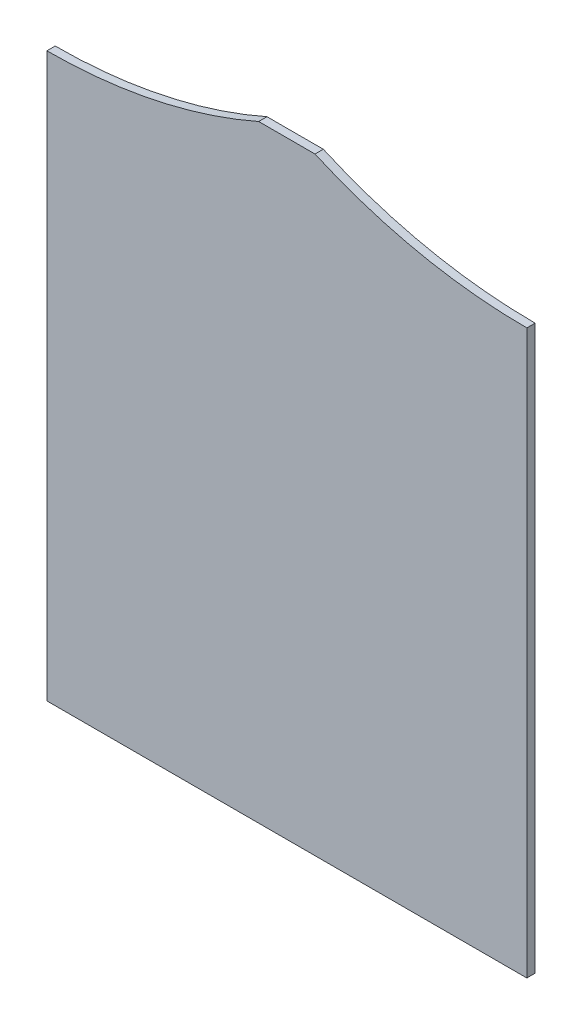
ISO-10303-21;
HEADER;
FILE_DESCRIPTION(('STEP AP214'),'2;1');
FILE_NAME('part.step','',(''),(''),'','','');
FILE_SCHEMA(('AUTOMOTIVE_DESIGN { 1 0 10303 214 1 1 1 1 }'));
ENDSEC;
DATA;
#1=APPLICATION_CONTEXT('core data for automotive mechanical design processes');
#2=APPLICATION_PROTOCOL_DEFINITION('international standard','automotive_design',2000,#1);
#3=PRODUCT_CONTEXT('',#1,'mechanical');
#4=PRODUCT('Part','Part','',(#3));
#5=PRODUCT_RELATED_PRODUCT_CATEGORY('part','',(#4));
#6=PRODUCT_DEFINITION_FORMATION('','',#4);
#7=PRODUCT_DEFINITION_CONTEXT('part definition',#1,'design');
#8=PRODUCT_DEFINITION('design','',#6,#7);
#9=PRODUCT_DEFINITION_SHAPE('','',#8);
#10=(LENGTH_UNIT() NAMED_UNIT(*) SI_UNIT(.MILLI.,.METRE.));
#11=(NAMED_UNIT(*) PLANE_ANGLE_UNIT() SI_UNIT($,.RADIAN.));
#12=(NAMED_UNIT(*) SI_UNIT($,.STERADIAN.) SOLID_ANGLE_UNIT());
#13=UNCERTAINTY_MEASURE_WITH_UNIT(LENGTH_MEASURE(1.E-05),#10,'distance_accuracy_value','');
#14=(GEOMETRIC_REPRESENTATION_CONTEXT(3) GLOBAL_UNCERTAINTY_ASSIGNED_CONTEXT((#13)) GLOBAL_UNIT_ASSIGNED_CONTEXT((#10,
#11,#12)) REPRESENTATION_CONTEXT('',''));
#15=CARTESIAN_POINT('',(0.,0.,0.));
#16=DIRECTION('',(0.,0.,1.));
#17=DIRECTION('',(1.,0.,0.));
#18=AXIS2_PLACEMENT_3D('',#15,#16,#17);
#19=CARTESIAN_POINT('',(-135.147392290249,273.641202928556,2.95));
#20=DIRECTION('',(0.,0.,-1.));
#21=DIRECTION('',(-1.,0.,0.));
#22=AXIS2_PLACEMENT_3D('',#19,#20,#21);
#23=CYLINDRICAL_SURFACE('',#22,186.339615626969);
#24=CARTESIAN_POINT('',(-135.147392290249,273.641202928556,0.));
#25=DIRECTION('',(0.,0.,-1.));
#26=DIRECTION('',(1.,0.,0.));
#27=AXIS2_PLACEMENT_3D('',#24,#25,#26);
#28=CIRCLE('',#27,186.339615626969);
#29=CARTESIAN_POINT('',(-59.8973922902495,103.171587301587,0.));
#30=VERTEX_POINT('',#29);
#31=CARTESIAN_POINT('',(-135.147392290249,87.3015873015873,0.));
#32=VERTEX_POINT('',#31);
#33=EDGE_CURVE('E116',#30,#32,#28,.T.);
#34=ORIENTED_EDGE('',*,*,#33,.T.);
#35=DIRECTION('',(0.,0.,-1.));
#36=VECTOR('',#35,1.);
#37=CARTESIAN_POINT('',(-135.147392290249,87.3015873015873,2.95));
#38=LINE('',#37,#36);
#39=CARTESIAN_POINT('',(-135.147392290249,87.3015873015873,2.95));
#40=VERTEX_POINT('',#39);
#41=EDGE_CURVE('E11',#40,#32,#38,.T.);
#42=ORIENTED_EDGE('',*,*,#41,.F.);
#43=CARTESIAN_POINT('',(-135.147392290249,273.641202928556,2.95));
#44=DIRECTION('',(0.,0.,-1.));
#45=DIRECTION('',(1.,0.,0.));
#46=AXIS2_PLACEMENT_3D('',#43,#44,#45);
#47=CIRCLE('',#46,186.339615626969);
#48=CARTESIAN_POINT('',(-59.8973922902495,103.171587301587,2.95));
#49=VERTEX_POINT('',#48);
#50=EDGE_CURVE('E126',#49,#40,#47,.T.);
#51=ORIENTED_EDGE('',*,*,#50,.F.);
#52=DIRECTION('',(0.,0.,-1.));
#53=VECTOR('',#52,1.);
#54=CARTESIAN_POINT('',(-59.8973922902495,103.171587301587,2.95));
#55=LINE('',#54,#53);
#56=EDGE_CURVE('E112',#49,#30,#55,.T.);
#57=ORIENTED_EDGE('',*,*,#56,.T.);
#58=EDGE_LOOP('',(#34,#42,#51,#57));
#59=FACE_BOUND('',#58,.T.);
#60=ADVANCED_FACE('F32',(#59),#23,.F.);
#61=CARTESIAN_POINT('',(-135.147392290249,87.3015873015873,2.95));
#62=DIRECTION('',(1.,0.,0.));
#63=DIRECTION('',(0.,0.,-1.));
#64=AXIS2_PLACEMENT_3D('',#61,#62,#63);
#65=PLANE('',#64);
#66=DIRECTION('',(0.,-1.,0.));
#67=VECTOR('',#66,1.);
#68=CARTESIAN_POINT('',(-135.147392290249,87.3015873015873,0.));
#69=LINE('',#68,#67);
#70=CARTESIAN_POINT('',(-135.147392290249,-112.698412698413,0.));
#71=VERTEX_POINT('',#70);
#72=EDGE_CURVE('E119',#32,#71,#69,.T.);
#73=ORIENTED_EDGE('',*,*,#72,.T.);
#74=DIRECTION('',(0.,0.,-1.));
#75=VECTOR('',#74,1.);
#76=CARTESIAN_POINT('',(-135.147392290249,-112.698412698413,2.95));
#77=LINE('',#76,#75);
#78=CARTESIAN_POINT('',(-135.147392290249,-112.698412698413,2.95));
#79=VERTEX_POINT('',#78);
#80=EDGE_CURVE('E40',#79,#71,#77,.T.);
#81=ORIENTED_EDGE('',*,*,#80,.F.);
#82=DIRECTION('',(0.,-1.,0.));
#83=VECTOR('',#82,1.);
#84=CARTESIAN_POINT('',(-135.147392290249,87.3015873015873,2.95));
#85=LINE('',#84,#83);
#86=EDGE_CURVE('E85',#40,#79,#85,.T.);
#87=ORIENTED_EDGE('',*,*,#86,.F.);
#88=ORIENTED_EDGE('',*,*,#41,.T.);
#89=EDGE_LOOP('',(#73,#81,#87,#88));
#90=FACE_BOUND('',#89,.T.);
#91=ADVANCED_FACE('F150',(#90),#65,.F.);
#92=CARTESIAN_POINT('',(-135.147392290249,-112.698412698413,2.95));
#93=DIRECTION('',(0.,1.,0.));
#94=DIRECTION('',(0.,0.,1.));
#95=AXIS2_PLACEMENT_3D('',#92,#93,#94);
#96=PLANE('',#95);
#97=DIRECTION('',(1.,0.,0.));
#98=VECTOR('',#97,1.);
#99=CARTESIAN_POINT('',(-135.147392290249,-112.698412698413,0.));
#100=LINE('',#99,#98);
#101=CARTESIAN_POINT('',(35.3526077097505,-112.698412698413,0.));
#102=VERTEX_POINT('',#101);
#103=EDGE_CURVE('E121',#71,#102,#100,.T.);
#104=ORIENTED_EDGE('',*,*,#103,.T.);
#105=DIRECTION('',(0.,0.,-1.));
#106=VECTOR('',#105,1.);
#107=CARTESIAN_POINT('',(35.3526077097505,-112.698412698413,2.95));
#108=LINE('',#107,#106);
#109=CARTESIAN_POINT('',(35.3526077097505,-112.698412698413,2.95));
#110=VERTEX_POINT('',#109);
#111=EDGE_CURVE('E107',#110,#102,#108,.T.);
#112=ORIENTED_EDGE('',*,*,#111,.F.);
#113=DIRECTION('',(1.,0.,0.));
#114=VECTOR('',#113,1.);
#115=CARTESIAN_POINT('',(-135.147392290249,-112.698412698413,2.95));
#116=LINE('',#115,#114);
#117=EDGE_CURVE('E98',#79,#110,#116,.T.);
#118=ORIENTED_EDGE('',*,*,#117,.F.);
#119=ORIENTED_EDGE('',*,*,#80,.T.);
#120=EDGE_LOOP('',(#104,#112,#118,#119));
#121=FACE_BOUND('',#120,.T.);
#122=ADVANCED_FACE('F132',(#121),#96,.F.);
#123=CARTESIAN_POINT('',(35.3526077097505,87.3015873015873,2.95));
#124=DIRECTION('',(-1.,0.,0.));
#125=DIRECTION('',(0.,-1.,0.));
#126=AXIS2_PLACEMENT_3D('',#123,#124,#125);
#127=PLANE('',#126);
#128=DIRECTION('',(0.,1.,0.));
#129=VECTOR('',#128,1.);
#130=CARTESIAN_POINT('',(35.3526077097505,87.3015873015873,0.));
#131=LINE('',#130,#129);
#132=CARTESIAN_POINT('',(35.3526077097505,87.3015873015873,0.));
#133=VERTEX_POINT('',#132);
#134=EDGE_CURVE('E106',#102,#133,#131,.T.);
#135=ORIENTED_EDGE('',*,*,#134,.T.);
#136=DIRECTION('',(0.,0.,-1.));
#137=VECTOR('',#136,1.);
#138=CARTESIAN_POINT('',(35.3526077097505,87.3015873015873,2.95));
#139=LINE('',#138,#137);
#140=CARTESIAN_POINT('',(35.3526077097505,87.3015873015873,2.95));
#141=VERTEX_POINT('',#140);
#142=EDGE_CURVE('E103',#141,#133,#139,.T.);
#143=ORIENTED_EDGE('',*,*,#142,.F.);
#144=DIRECTION('',(0.,1.,0.));
#145=VECTOR('',#144,1.);
#146=CARTESIAN_POINT('',(35.3526077097505,87.3015873015873,2.95));
#147=LINE('',#146,#145);
#148=EDGE_CURVE('E92',#110,#141,#147,.T.);
#149=ORIENTED_EDGE('',*,*,#148,.F.);
#150=ORIENTED_EDGE('',*,*,#111,.T.);
#151=EDGE_LOOP('',(#135,#143,#149,#150));
#152=FACE_BOUND('',#151,.T.);
#153=ADVANCED_FACE('F104',(#152),#127,.F.);
#154=CARTESIAN_POINT('',(35.3526077097504,273.641202928556,2.95));
#155=DIRECTION('',(0.,0.,-1.));
#156=DIRECTION('',(-1.,0.,0.));
#157=AXIS2_PLACEMENT_3D('',#154,#155,#156);
#158=CYLINDRICAL_SURFACE('',#157,186.339615626969);
#159=CARTESIAN_POINT('',(35.3526077097504,273.641202928556,0.));
#160=DIRECTION('',(0.,0.,-1.));
#161=DIRECTION('',(1.,0.,0.));
#162=AXIS2_PLACEMENT_3D('',#159,#160,#161);
#163=CIRCLE('',#162,186.339615626969);
#164=CARTESIAN_POINT('',(-39.8973922902495,103.171587301587,0.));
#165=VERTEX_POINT('',#164);
#166=EDGE_CURVE('E71',#133,#165,#163,.T.);
#167=ORIENTED_EDGE('',*,*,#166,.T.);
#168=DIRECTION('',(0.,0.,-1.));
#169=VECTOR('',#168,1.);
#170=CARTESIAN_POINT('',(-39.8973922902495,103.171587301587,2.95));
#171=LINE('',#170,#169);
#172=CARTESIAN_POINT('',(-39.8973922902495,103.171587301587,2.95));
#173=VERTEX_POINT('',#172);
#174=EDGE_CURVE('E108',#173,#165,#171,.T.);
#175=ORIENTED_EDGE('',*,*,#174,.F.);
#176=CARTESIAN_POINT('',(35.3526077097504,273.641202928556,2.95));
#177=DIRECTION('',(0.,0.,-1.));
#178=DIRECTION('',(1.,0.,0.));
#179=AXIS2_PLACEMENT_3D('',#176,#177,#178);
#180=CIRCLE('',#179,186.339615626969);
#181=EDGE_CURVE('E96',#141,#173,#180,.T.);
#182=ORIENTED_EDGE('',*,*,#181,.F.);
#183=ORIENTED_EDGE('',*,*,#142,.T.);
#184=EDGE_LOOP('',(#167,#175,#182,#183));
#185=FACE_BOUND('',#184,.T.);
#186=ADVANCED_FACE('F110',(#185),#158,.F.);
#187=CARTESIAN_POINT('',(-59.8973922902495,103.171587301587,2.95));
#188=DIRECTION('',(0.,-1.,0.));
#189=DIRECTION('',(0.,0.,-1.));
#190=AXIS2_PLACEMENT_3D('',#187,#188,#189);
#191=PLANE('',#190);
#192=DIRECTION('',(-1.,0.,0.));
#193=VECTOR('',#192,1.);
#194=CARTESIAN_POINT('',(-59.8973922902495,103.171587301587,0.));
#195=LINE('',#194,#193);
#196=EDGE_CURVE('E77',#165,#30,#195,.T.);
#197=ORIENTED_EDGE('',*,*,#196,.T.);
#198=ORIENTED_EDGE('',*,*,#56,.F.);
#199=DIRECTION('',(-1.,0.,0.));
#200=VECTOR('',#199,1.);
#201=CARTESIAN_POINT('',(-59.8973922902495,103.171587301587,2.95));
#202=LINE('',#201,#200);
#203=EDGE_CURVE('E48',#173,#49,#202,.T.);
#204=ORIENTED_EDGE('',*,*,#203,.F.);
#205=ORIENTED_EDGE('',*,*,#174,.T.);
#206=EDGE_LOOP('',(#197,#198,#204,#205));
#207=FACE_BOUND('',#206,.T.);
#208=ADVANCED_FACE('F139',(#207),#191,.F.);
#209=CARTESIAN_POINT('',(-135.147392290249,273.641202928556,2.95));
#210=DIRECTION('',(0.,0.,1.));
#211=DIRECTION('',(1.,0.,0.));
#212=AXIS2_PLACEMENT_3D('',#209,#210,#211);
#213=PLANE('',#212);
#214=ORIENTED_EDGE('',*,*,#50,.T.);
#215=ORIENTED_EDGE('',*,*,#86,.T.);
#216=ORIENTED_EDGE('',*,*,#117,.T.);
#217=ORIENTED_EDGE('',*,*,#148,.T.);
#218=ORIENTED_EDGE('',*,*,#181,.T.);
#219=ORIENTED_EDGE('',*,*,#203,.T.);
#220=EDGE_LOOP('',(#214,#215,#216,#217,#218,#219));
#221=FACE_BOUND('',#220,.T.);
#222=ADVANCED_FACE('F94',(#221),#213,.T.);
#223=CARTESIAN_POINT('',(-135.147392290249,273.641202928556,0.));
#224=DIRECTION('',(0.,0.,1.));
#225=DIRECTION('',(1.,0.,0.));
#226=AXIS2_PLACEMENT_3D('',#223,#224,#225);
#227=PLANE('',#226);
#228=ORIENTED_EDGE('',*,*,#33,.F.);
#229=ORIENTED_EDGE('',*,*,#196,.F.);
#230=ORIENTED_EDGE('',*,*,#166,.F.);
#231=ORIENTED_EDGE('',*,*,#134,.F.);
#232=ORIENTED_EDGE('',*,*,#103,.F.);
#233=ORIENTED_EDGE('',*,*,#72,.F.);
#234=EDGE_LOOP('',(#228,#229,#230,#231,#232,#233));
#235=FACE_BOUND('',#234,.T.);
#236=ADVANCED_FACE('F135',(#235),#227,.F.);
#237=CLOSED_SHELL('',(#60,#91,#122,#153,#186,#208,#222,#236));
#238=MANIFOLD_SOLID_BREP('B2',#237);
#239=ADVANCED_BREP_SHAPE_REPRESENTATION('',(#18,#238),#14);
#240=SHAPE_DEFINITION_REPRESENTATION(#9,#239);
ENDSEC;
END-ISO-10303-21;
